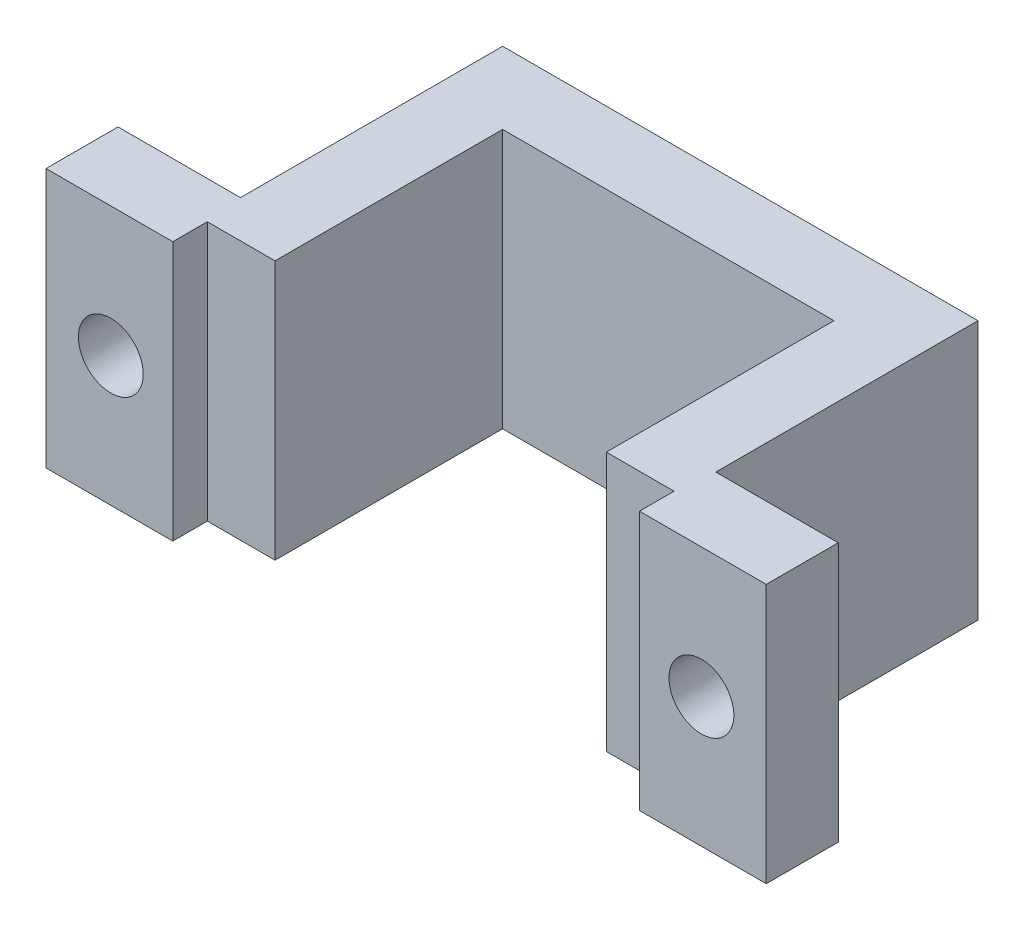
ISO-10303-21;
HEADER;
FILE_DESCRIPTION(('STEP AP214'),'2;1');
FILE_NAME('part.step','',(''),(''),'','','');
FILE_SCHEMA(('AUTOMOTIVE_DESIGN { 1 0 10303 214 1 1 1 1 }'));
ENDSEC;
DATA;
#1=APPLICATION_CONTEXT('core data for automotive mechanical design processes');
#2=APPLICATION_PROTOCOL_DEFINITION('international standard','automotive_design',2000,#1);
#3=PRODUCT_CONTEXT('',#1,'mechanical');
#4=PRODUCT('Part','Part','',(#3));
#5=PRODUCT_RELATED_PRODUCT_CATEGORY('part','',(#4));
#6=PRODUCT_DEFINITION_FORMATION('','',#4);
#7=PRODUCT_DEFINITION_CONTEXT('part definition',#1,'design');
#8=PRODUCT_DEFINITION('design','',#6,#7);
#9=PRODUCT_DEFINITION_SHAPE('','',#8);
#10=(LENGTH_UNIT() NAMED_UNIT(*) SI_UNIT(.MILLI.,.METRE.));
#11=(NAMED_UNIT(*) PLANE_ANGLE_UNIT() SI_UNIT($,.RADIAN.));
#12=(NAMED_UNIT(*) SI_UNIT($,.STERADIAN.) SOLID_ANGLE_UNIT());
#13=UNCERTAINTY_MEASURE_WITH_UNIT(LENGTH_MEASURE(1.E-05),#10,'distance_accuracy_value','');
#14=(GEOMETRIC_REPRESENTATION_CONTEXT(3) GLOBAL_UNCERTAINTY_ASSIGNED_CONTEXT((#13)) GLOBAL_UNIT_ASSIGNED_CONTEXT((#10,
#11,#12)) REPRESENTATION_CONTEXT('',''));
#15=CARTESIAN_POINT('',(0.,0.,0.));
#16=DIRECTION('',(0.,0.,1.));
#17=DIRECTION('',(1.,0.,0.));
#18=AXIS2_PLACEMENT_3D('',#15,#16,#17);
#19=CARTESIAN_POINT('',(0.,18.,0.));
#20=DIRECTION('',(1.,0.,0.));
#21=DIRECTION('',(0.,0.,-1.));
#22=AXIS2_PLACEMENT_3D('',#19,#20,#21);
#23=PLANE('',#22);
#24=DIRECTION('',(0.,0.,1.));
#25=VECTOR('',#24,1.);
#26=CARTESIAN_POINT('',(0.,0.,0.));
#27=LINE('',#26,#25);
#28=CARTESIAN_POINT('',(0.,0.,-5.));
#29=VERTEX_POINT('',#28);
#30=CARTESIAN_POINT('',(0.,0.,0.));
#31=VERTEX_POINT('',#30);
#32=EDGE_CURVE('E181',#29,#31,#27,.T.);
#33=ORIENTED_EDGE('',*,*,#32,.T.);
#34=DIRECTION('',(0.,-1.,0.));
#35=VECTOR('',#34,1.);
#36=CARTESIAN_POINT('',(0.,18.,0.));
#37=LINE('',#36,#35);
#38=CARTESIAN_POINT('',(0.,18.,0.));
#39=VERTEX_POINT('',#38);
#40=EDGE_CURVE('E11',#39,#31,#37,.T.);
#41=ORIENTED_EDGE('',*,*,#40,.F.);
#42=DIRECTION('',(0.,0.,1.));
#43=VECTOR('',#42,1.);
#44=CARTESIAN_POINT('',(0.,18.,0.));
#45=LINE('',#44,#43);
#46=CARTESIAN_POINT('',(0.,18.,-5.));
#47=VERTEX_POINT('',#46);
#48=EDGE_CURVE('E212',#47,#39,#45,.T.);
#49=ORIENTED_EDGE('',*,*,#48,.F.);
#50=DIRECTION('',(0.,-1.,0.));
#51=VECTOR('',#50,1.);
#52=CARTESIAN_POINT('',(0.,18.,-5.));
#53=LINE('',#52,#51);
#54=EDGE_CURVE('E177',#47,#29,#53,.T.);
#55=ORIENTED_EDGE('',*,*,#54,.T.);
#56=EDGE_LOOP('',(#33,#41,#49,#55));
#57=FACE_BOUND('',#56,.T.);
#58=ADVANCED_FACE('F37',(#57),#23,.F.);
#59=CARTESIAN_POINT('',(0.,18.,0.));
#60=DIRECTION('',(0.,0.,-1.));
#61=DIRECTION('',(-1.,0.,0.));
#62=AXIS2_PLACEMENT_3D('',#59,#60,#61);
#63=PLANE('',#62);
#64=CARTESIAN_POINT('',(4.49999999999999,9.,0.));
#65=DIRECTION('',(0.,0.,-1.));
#66=DIRECTION('',(1.,0.,0.));
#67=AXIS2_PLACEMENT_3D('',#64,#65,#66);
#68=CIRCLE('',#67,2.25);
#69=CARTESIAN_POINT('',(6.74999999999999,9.,0.));
#70=VERTEX_POINT('',#69);
#71=EDGE_CURVE('E433',#70,#70,#68,.T.);
#72=ORIENTED_EDGE('',*,*,#71,.T.);
#73=EDGE_LOOP('',(#72));
#74=FACE_BOUND('',#73,.T.);
#75=DIRECTION('',(1.,0.,0.));
#76=VECTOR('',#75,1.);
#77=CARTESIAN_POINT('',(0.,0.,0.));
#78=LINE('',#77,#76);
#79=CARTESIAN_POINT('',(8.8,0.,0.));
#80=VERTEX_POINT('',#79);
#81=EDGE_CURVE('E184',#31,#80,#78,.T.);
#82=ORIENTED_EDGE('',*,*,#81,.T.);
#83=DIRECTION('',(0.,-1.,0.));
#84=VECTOR('',#83,1.);
#85=CARTESIAN_POINT('',(8.8,18.,0.));
#86=LINE('',#85,#84);
#87=CARTESIAN_POINT('',(8.8,18.,0.));
#88=VERTEX_POINT('',#87);
#89=EDGE_CURVE('E45',#88,#80,#86,.T.);
#90=ORIENTED_EDGE('',*,*,#89,.F.);
#91=DIRECTION('',(1.,0.,0.));
#92=VECTOR('',#91,1.);
#93=CARTESIAN_POINT('',(0.,18.,0.));
#94=LINE('',#93,#92);
#95=EDGE_CURVE('E120',#39,#88,#94,.T.);
#96=ORIENTED_EDGE('',*,*,#95,.F.);
#97=ORIENTED_EDGE('',*,*,#40,.T.);
#98=EDGE_LOOP('',(#82,#90,#96,#97));
#99=FACE_BOUND('',#98,.T.);
#100=ADVANCED_FACE('F312',(#74,#99),#63,.F.);
#101=CARTESIAN_POINT('',(8.8,18.,0.));
#102=DIRECTION('',(-1.,0.,0.));
#103=DIRECTION('',(0.,0.,1.));
#104=AXIS2_PLACEMENT_3D('',#101,#102,#103);
#105=PLANE('',#104);
#106=DIRECTION('',(0.,0.,-1.));
#107=VECTOR('',#106,1.);
#108=CARTESIAN_POINT('',(8.8,0.,0.));
#109=LINE('',#108,#107);
#110=CARTESIAN_POINT('',(8.8,0.,-2.4));
#111=VERTEX_POINT('',#110);
#112=EDGE_CURVE('E187',#80,#111,#109,.T.);
#113=ORIENTED_EDGE('',*,*,#112,.T.);
#114=DIRECTION('',(0.,-1.,0.));
#115=VECTOR('',#114,1.);
#116=CARTESIAN_POINT('',(8.8,18.,-2.4));
#117=LINE('',#116,#115);
#118=CARTESIAN_POINT('',(8.8,18.,-2.4));
#119=VERTEX_POINT('',#118);
#120=EDGE_CURVE('E243',#119,#111,#117,.T.);
#121=ORIENTED_EDGE('',*,*,#120,.F.);
#122=DIRECTION('',(0.,0.,-1.));
#123=VECTOR('',#122,1.);
#124=CARTESIAN_POINT('',(8.8,18.,0.));
#125=LINE('',#124,#123);
#126=EDGE_CURVE('E251',#88,#119,#125,.T.);
#127=ORIENTED_EDGE('',*,*,#126,.F.);
#128=ORIENTED_EDGE('',*,*,#89,.T.);
#129=EDGE_LOOP('',(#113,#121,#127,#128));
#130=FACE_BOUND('',#129,.T.);
#131=ADVANCED_FACE('F249',(#130),#105,.F.);
#132=CARTESIAN_POINT('',(8.8,18.,-2.4));
#133=DIRECTION('',(0.,0.,-1.));
#134=DIRECTION('',(-1.,0.,0.));
#135=AXIS2_PLACEMENT_3D('',#132,#133,#134);
#136=PLANE('',#135);
#137=DIRECTION('',(1.,0.,0.));
#138=VECTOR('',#137,1.);
#139=CARTESIAN_POINT('',(8.8,0.,-2.4));
#140=LINE('',#139,#138);
#141=CARTESIAN_POINT('',(13.5,0.,-2.4));
#142=VERTEX_POINT('',#141);
#143=EDGE_CURVE('E189',#111,#142,#140,.T.);
#144=ORIENTED_EDGE('',*,*,#143,.T.);
#145=DIRECTION('',(0.,-1.,0.));
#146=VECTOR('',#145,1.);
#147=CARTESIAN_POINT('',(13.5,18.,-2.4));
#148=LINE('',#147,#146);
#149=CARTESIAN_POINT('',(13.5,18.,-2.4));
#150=VERTEX_POINT('',#149);
#151=EDGE_CURVE('E240',#150,#142,#148,.T.);
#152=ORIENTED_EDGE('',*,*,#151,.F.);
#153=DIRECTION('',(1.,0.,0.));
#154=VECTOR('',#153,1.);
#155=CARTESIAN_POINT('',(8.8,18.,-2.4));
#156=LINE('',#155,#154);
#157=EDGE_CURVE('E269',#119,#150,#156,.T.);
#158=ORIENTED_EDGE('',*,*,#157,.F.);
#159=ORIENTED_EDGE('',*,*,#120,.T.);
#160=EDGE_LOOP('',(#144,#152,#158,#159));
#161=FACE_BOUND('',#160,.T.);
#162=ADVANCED_FACE('F260',(#161),#136,.F.);
#163=CARTESIAN_POINT('',(13.5,18.,-2.4));
#164=DIRECTION('',(-1.,0.,0.));
#165=DIRECTION('',(0.,0.,1.));
#166=AXIS2_PLACEMENT_3D('',#163,#164,#165);
#167=PLANE('',#166);
#168=DIRECTION('',(0.,0.,-1.));
#169=VECTOR('',#168,1.);
#170=CARTESIAN_POINT('',(13.5,0.,-2.4));
#171=LINE('',#170,#169);
#172=CARTESIAN_POINT('',(13.5,0.,-18.2));
#173=VERTEX_POINT('',#172);
#174=EDGE_CURVE('E191',#142,#173,#171,.T.);
#175=ORIENTED_EDGE('',*,*,#174,.T.);
#176=DIRECTION('',(0.,-1.,0.));
#177=VECTOR('',#176,1.);
#178=CARTESIAN_POINT('',(13.5,18.,-18.2));
#179=LINE('',#178,#177);
#180=CARTESIAN_POINT('',(13.5,18.,-18.2));
#181=VERTEX_POINT('',#180);
#182=EDGE_CURVE('E237',#181,#173,#179,.T.);
#183=ORIENTED_EDGE('',*,*,#182,.F.);
#184=DIRECTION('',(0.,0.,-1.));
#185=VECTOR('',#184,1.);
#186=CARTESIAN_POINT('',(13.5,18.,-2.4));
#187=LINE('',#186,#185);
#188=EDGE_CURVE('E266',#150,#181,#187,.T.);
#189=ORIENTED_EDGE('',*,*,#188,.F.);
#190=ORIENTED_EDGE('',*,*,#151,.T.);
#191=EDGE_LOOP('',(#175,#183,#189,#190));
#192=FACE_BOUND('',#191,.T.);
#193=ADVANCED_FACE('F264',(#192),#167,.F.);
#194=CARTESIAN_POINT('',(13.5,18.,-18.2));
#195=DIRECTION('',(0.,0.,-1.));
#196=DIRECTION('',(-1.,0.,0.));
#197=AXIS2_PLACEMENT_3D('',#194,#195,#196);
#198=PLANE('',#197);
#199=DIRECTION('',(1.,0.,0.));
#200=VECTOR('',#199,1.);
#201=CARTESIAN_POINT('',(13.5,0.,-18.2));
#202=LINE('',#201,#200);
#203=CARTESIAN_POINT('',(36.5,0.,-18.2));
#204=VERTEX_POINT('',#203);
#205=EDGE_CURVE('E193',#173,#204,#202,.T.);
#206=ORIENTED_EDGE('',*,*,#205,.T.);
#207=DIRECTION('',(0.,-1.,0.));
#208=VECTOR('',#207,1.);
#209=CARTESIAN_POINT('',(36.5,18.,-18.2));
#210=LINE('',#209,#208);
#211=CARTESIAN_POINT('',(36.5,18.,-18.2));
#212=VERTEX_POINT('',#211);
#213=EDGE_CURVE('E234',#212,#204,#210,.T.);
#214=ORIENTED_EDGE('',*,*,#213,.F.);
#215=DIRECTION('',(1.,0.,0.));
#216=VECTOR('',#215,1.);
#217=CARTESIAN_POINT('',(13.5,18.,-18.2));
#218=LINE('',#217,#216);
#219=EDGE_CURVE('E268',#181,#212,#218,.T.);
#220=ORIENTED_EDGE('',*,*,#219,.F.);
#221=ORIENTED_EDGE('',*,*,#182,.T.);
#222=EDGE_LOOP('',(#206,#214,#220,#221));
#223=FACE_BOUND('',#222,.T.);
#224=ADVANCED_FACE('F327',(#223),#198,.F.);
#225=CARTESIAN_POINT('',(36.5,18.,-2.40000000000001));
#226=DIRECTION('',(1.,0.,0.));
#227=DIRECTION('',(0.,0.,-1.));
#228=AXIS2_PLACEMENT_3D('',#225,#226,#227);
#229=PLANE('',#228);
#230=DIRECTION('',(0.,0.,1.));
#231=VECTOR('',#230,1.);
#232=CARTESIAN_POINT('',(36.5,0.,-2.40000000000001));
#233=LINE('',#232,#231);
#234=CARTESIAN_POINT('',(36.5,0.,-2.40000000000001));
#235=VERTEX_POINT('',#234);
#236=EDGE_CURVE('E195',#204,#235,#233,.T.);
#237=ORIENTED_EDGE('',*,*,#236,.T.);
#238=DIRECTION('',(0.,-1.,0.));
#239=VECTOR('',#238,1.);
#240=CARTESIAN_POINT('',(36.5,18.,-2.40000000000001));
#241=LINE('',#240,#239);
#242=CARTESIAN_POINT('',(36.5,18.,-2.40000000000001));
#243=VERTEX_POINT('',#242);
#244=EDGE_CURVE('E231',#243,#235,#241,.T.);
#245=ORIENTED_EDGE('',*,*,#244,.F.);
#246=DIRECTION('',(0.,0.,1.));
#247=VECTOR('',#246,1.);
#248=CARTESIAN_POINT('',(36.5,18.,-2.40000000000001));
#249=LINE('',#248,#247);
#250=EDGE_CURVE('E271',#212,#243,#249,.T.);
#251=ORIENTED_EDGE('',*,*,#250,.F.);
#252=ORIENTED_EDGE('',*,*,#213,.T.);
#253=EDGE_LOOP('',(#237,#245,#251,#252));
#254=FACE_BOUND('',#253,.T.);
#255=ADVANCED_FACE('F330',(#254),#229,.F.);
#256=CARTESIAN_POINT('',(41.2,18.,-2.40000000000002));
#257=DIRECTION('',(0.,0.,-1.));
#258=DIRECTION('',(-1.,0.,0.));
#259=AXIS2_PLACEMENT_3D('',#256,#257,#258);
#260=PLANE('',#259);
#261=DIRECTION('',(1.,0.,0.));
#262=VECTOR('',#261,1.);
#263=CARTESIAN_POINT('',(41.2,0.,-2.40000000000002));
#264=LINE('',#263,#262);
#265=CARTESIAN_POINT('',(41.2,0.,-2.40000000000002));
#266=VERTEX_POINT('',#265);
#267=EDGE_CURVE('E197',#235,#266,#264,.T.);
#268=ORIENTED_EDGE('',*,*,#267,.T.);
#269=DIRECTION('',(0.,-1.,0.));
#270=VECTOR('',#269,1.);
#271=CARTESIAN_POINT('',(41.2,18.,-2.40000000000002));
#272=LINE('',#271,#270);
#273=CARTESIAN_POINT('',(41.2,18.,-2.40000000000002));
#274=VERTEX_POINT('',#273);
#275=EDGE_CURVE('E228',#274,#266,#272,.T.);
#276=ORIENTED_EDGE('',*,*,#275,.F.);
#277=DIRECTION('',(1.,0.,0.));
#278=VECTOR('',#277,1.);
#279=CARTESIAN_POINT('',(41.2,18.,-2.40000000000002));
#280=LINE('',#279,#278);
#281=EDGE_CURVE('E277',#243,#274,#280,.T.);
#282=ORIENTED_EDGE('',*,*,#281,.F.);
#283=ORIENTED_EDGE('',*,*,#244,.T.);
#284=EDGE_LOOP('',(#268,#276,#282,#283));
#285=FACE_BOUND('',#284,.T.);
#286=ADVANCED_FACE('F334',(#285),#260,.F.);
#287=CARTESIAN_POINT('',(41.2,18.,0.));
#288=DIRECTION('',(1.,0.,0.));
#289=DIRECTION('',(0.,0.,-1.));
#290=AXIS2_PLACEMENT_3D('',#287,#288,#289);
#291=PLANE('',#290);
#292=DIRECTION('',(0.,0.,1.));
#293=VECTOR('',#292,1.);
#294=CARTESIAN_POINT('',(41.2,0.,0.));
#295=LINE('',#294,#293);
#296=CARTESIAN_POINT('',(41.2,0.,0.));
#297=VERTEX_POINT('',#296);
#298=EDGE_CURVE('E199',#266,#297,#295,.T.);
#299=ORIENTED_EDGE('',*,*,#298,.T.);
#300=DIRECTION('',(0.,-1.,0.));
#301=VECTOR('',#300,1.);
#302=CARTESIAN_POINT('',(41.2,18.,0.));
#303=LINE('',#302,#301);
#304=CARTESIAN_POINT('',(41.2,18.,0.));
#305=VERTEX_POINT('',#304);
#306=EDGE_CURVE('E225',#305,#297,#303,.T.);
#307=ORIENTED_EDGE('',*,*,#306,.F.);
#308=DIRECTION('',(0.,0.,1.));
#309=VECTOR('',#308,1.);
#310=CARTESIAN_POINT('',(41.2,18.,0.));
#311=LINE('',#310,#309);
#312=EDGE_CURVE('E279',#274,#305,#311,.T.);
#313=ORIENTED_EDGE('',*,*,#312,.F.);
#314=ORIENTED_EDGE('',*,*,#275,.T.);
#315=EDGE_LOOP('',(#299,#307,#313,#314));
#316=FACE_BOUND('',#315,.T.);
#317=ADVANCED_FACE('F338',(#316),#291,.F.);
#318=CARTESIAN_POINT('',(50.,18.,0.));
#319=DIRECTION('',(0.,0.,-1.));
#320=DIRECTION('',(-1.,0.,0.));
#321=AXIS2_PLACEMENT_3D('',#318,#319,#320);
#322=PLANE('',#321);
#323=CARTESIAN_POINT('',(45.5,9.,0.));
#324=DIRECTION('',(0.,0.,-1.));
#325=DIRECTION('',(-1.,0.,0.));
#326=AXIS2_PLACEMENT_3D('',#323,#324,#325);
#327=CIRCLE('',#326,2.25);
#328=CARTESIAN_POINT('',(43.25,9.,0.));
#329=VERTEX_POINT('',#328);
#330=EDGE_CURVE('E185',#329,#329,#327,.T.);
#331=ORIENTED_EDGE('',*,*,#330,.T.);
#332=EDGE_LOOP('',(#331));
#333=FACE_BOUND('',#332,.T.);
#334=DIRECTION('',(1.,0.,0.));
#335=VECTOR('',#334,1.);
#336=CARTESIAN_POINT('',(50.,0.,0.));
#337=LINE('',#336,#335);
#338=CARTESIAN_POINT('',(50.,0.,0.));
#339=VERTEX_POINT('',#338);
#340=EDGE_CURVE('E201',#297,#339,#337,.T.);
#341=ORIENTED_EDGE('',*,*,#340,.T.);
#342=DIRECTION('',(0.,-1.,0.));
#343=VECTOR('',#342,1.);
#344=CARTESIAN_POINT('',(50.,18.,0.));
#345=LINE('',#344,#343);
#346=CARTESIAN_POINT('',(50.,18.,0.));
#347=VERTEX_POINT('',#346);
#348=EDGE_CURVE('E222',#347,#339,#345,.T.);
#349=ORIENTED_EDGE('',*,*,#348,.F.);
#350=DIRECTION('',(1.,0.,0.));
#351=VECTOR('',#350,1.);
#352=CARTESIAN_POINT('',(50.,18.,0.));
#353=LINE('',#352,#351);
#354=EDGE_CURVE('E281',#305,#347,#353,.T.);
#355=ORIENTED_EDGE('',*,*,#354,.F.);
#356=ORIENTED_EDGE('',*,*,#306,.T.);
#357=EDGE_LOOP('',(#341,#349,#355,#356));
#358=FACE_BOUND('',#357,.T.);
#359=ADVANCED_FACE('F342',(#333,#358),#322,.F.);
#360=CARTESIAN_POINT('',(50.,18.,0.));
#361=DIRECTION('',(-1.,0.,0.));
#362=DIRECTION('',(0.,0.,1.));
#363=AXIS2_PLACEMENT_3D('',#360,#361,#362);
#364=PLANE('',#363);
#365=DIRECTION('',(0.,0.,-1.));
#366=VECTOR('',#365,1.);
#367=CARTESIAN_POINT('',(50.,0.,0.));
#368=LINE('',#367,#366);
#369=CARTESIAN_POINT('',(50.,0.,-5.00000000000002));
#370=VERTEX_POINT('',#369);
#371=EDGE_CURVE('E203',#339,#370,#368,.T.);
#372=ORIENTED_EDGE('',*,*,#371,.T.);
#373=DIRECTION('',(0.,-1.,0.));
#374=VECTOR('',#373,1.);
#375=CARTESIAN_POINT('',(50.,18.,-5.00000000000002));
#376=LINE('',#375,#374);
#377=CARTESIAN_POINT('',(50.,18.,-5.00000000000002));
#378=VERTEX_POINT('',#377);
#379=EDGE_CURVE('E219',#378,#370,#376,.T.);
#380=ORIENTED_EDGE('',*,*,#379,.F.);
#381=DIRECTION('',(0.,0.,-1.));
#382=VECTOR('',#381,1.);
#383=CARTESIAN_POINT('',(50.,18.,0.));
#384=LINE('',#383,#382);
#385=EDGE_CURVE('E283',#347,#378,#384,.T.);
#386=ORIENTED_EDGE('',*,*,#385,.F.);
#387=ORIENTED_EDGE('',*,*,#348,.T.);
#388=EDGE_LOOP('',(#372,#380,#386,#387));
#389=FACE_BOUND('',#388,.T.);
#390=ADVANCED_FACE('F346',(#389),#364,.F.);
#391=CARTESIAN_POINT('',(50.,18.,-5.00000000000002));
#392=DIRECTION('',(0.,0.,1.));
#393=DIRECTION('',(1.,0.,0.));
#394=AXIS2_PLACEMENT_3D('',#391,#392,#393);
#395=PLANE('',#394);
#396=CARTESIAN_POINT('',(45.5,9.,-5.00000000000002));
#397=DIRECTION('',(0.,0.,-1.));
#398=DIRECTION('',(-1.,0.,0.));
#399=AXIS2_PLACEMENT_3D('',#396,#397,#398);
#400=CIRCLE('',#399,2.25);
#401=CARTESIAN_POINT('',(43.25,9.,-5.00000000000002));
#402=VERTEX_POINT('',#401);
#403=EDGE_CURVE('E432',#402,#402,#400,.T.);
#404=ORIENTED_EDGE('',*,*,#403,.F.);
#405=EDGE_LOOP('',(#404));
#406=FACE_BOUND('',#405,.T.);
#407=DIRECTION('',(-1.,0.,0.));
#408=VECTOR('',#407,1.);
#409=CARTESIAN_POINT('',(50.,0.,-5.00000000000002));
#410=LINE('',#409,#408);
#411=CARTESIAN_POINT('',(41.5,0.,-5.00000000000002));
#412=VERTEX_POINT('',#411);
#413=EDGE_CURVE('E205',#370,#412,#410,.T.);
#414=ORIENTED_EDGE('',*,*,#413,.T.);
#415=DIRECTION('',(0.,-1.,0.));
#416=VECTOR('',#415,1.);
#417=CARTESIAN_POINT('',(41.5,18.,-5.00000000000002));
#418=LINE('',#417,#416);
#419=CARTESIAN_POINT('',(41.5,18.,-5.00000000000002));
#420=VERTEX_POINT('',#419);
#421=EDGE_CURVE('E216',#420,#412,#418,.T.);
#422=ORIENTED_EDGE('',*,*,#421,.F.);
#423=DIRECTION('',(-1.,0.,0.));
#424=VECTOR('',#423,1.);
#425=CARTESIAN_POINT('',(50.,18.,-5.00000000000002));
#426=LINE('',#425,#424);
#427=EDGE_CURVE('E285',#378,#420,#426,.T.);
#428=ORIENTED_EDGE('',*,*,#427,.F.);
#429=ORIENTED_EDGE('',*,*,#379,.T.);
#430=EDGE_LOOP('',(#414,#422,#428,#429));
#431=FACE_BOUND('',#430,.T.);
#432=ADVANCED_FACE('F291',(#406,#431),#395,.F.);
#433=CARTESIAN_POINT('',(41.5,18.,-5.00000000000002));
#434=DIRECTION('',(-1.,0.,0.));
#435=DIRECTION('',(0.,0.,1.));
#436=AXIS2_PLACEMENT_3D('',#433,#434,#435);
#437=PLANE('',#436);
#438=DIRECTION('',(0.,0.,-1.));
#439=VECTOR('',#438,1.);
#440=CARTESIAN_POINT('',(41.5,0.,-5.00000000000002));
#441=LINE('',#440,#439);
#442=CARTESIAN_POINT('',(41.5,0.,-23.2));
#443=VERTEX_POINT('',#442);
#444=EDGE_CURVE('E207',#412,#443,#441,.T.);
#445=ORIENTED_EDGE('',*,*,#444,.T.);
#446=DIRECTION('',(0.,-1.,0.));
#447=VECTOR('',#446,1.);
#448=CARTESIAN_POINT('',(41.5,18.,-23.2));
#449=LINE('',#448,#447);
#450=CARTESIAN_POINT('',(41.5,18.,-23.2));
#451=VERTEX_POINT('',#450);
#452=EDGE_CURVE('E172',#451,#443,#449,.T.);
#453=ORIENTED_EDGE('',*,*,#452,.F.);
#454=DIRECTION('',(0.,0.,-1.));
#455=VECTOR('',#454,1.);
#456=CARTESIAN_POINT('',(41.5,18.,-5.00000000000002));
#457=LINE('',#456,#455);
#458=EDGE_CURVE('E163',#420,#451,#457,.T.);
#459=ORIENTED_EDGE('',*,*,#458,.F.);
#460=ORIENTED_EDGE('',*,*,#421,.T.);
#461=EDGE_LOOP('',(#445,#453,#459,#460));
#462=FACE_BOUND('',#461,.T.);
#463=ADVANCED_FACE('F295',(#462),#437,.F.);
#464=CARTESIAN_POINT('',(8.5,18.,-23.2));
#465=DIRECTION('',(0.,0.,1.));
#466=DIRECTION('',(1.,0.,0.));
#467=AXIS2_PLACEMENT_3D('',#464,#465,#466);
#468=PLANE('',#467);
#469=DIRECTION('',(-1.,0.,0.));
#470=VECTOR('',#469,1.);
#471=CARTESIAN_POINT('',(8.5,0.,-23.2));
#472=LINE('',#471,#470);
#473=CARTESIAN_POINT('',(8.5,0.,-23.2));
#474=VERTEX_POINT('',#473);
#475=EDGE_CURVE('E171',#443,#474,#472,.T.);
#476=ORIENTED_EDGE('',*,*,#475,.T.);
#477=DIRECTION('',(0.,-1.,0.));
#478=VECTOR('',#477,1.);
#479=CARTESIAN_POINT('',(8.5,18.,-23.2));
#480=LINE('',#479,#478);
#481=CARTESIAN_POINT('',(8.5,18.,-23.2));
#482=VERTEX_POINT('',#481);
#483=EDGE_CURVE('E168',#482,#474,#480,.T.);
#484=ORIENTED_EDGE('',*,*,#483,.F.);
#485=DIRECTION('',(-1.,0.,0.));
#486=VECTOR('',#485,1.);
#487=CARTESIAN_POINT('',(8.5,18.,-23.2));
#488=LINE('',#487,#486);
#489=EDGE_CURVE('E157',#451,#482,#488,.T.);
#490=ORIENTED_EDGE('',*,*,#489,.F.);
#491=ORIENTED_EDGE('',*,*,#452,.T.);
#492=EDGE_LOOP('',(#476,#484,#490,#491));
#493=FACE_BOUND('',#492,.T.);
#494=ADVANCED_FACE('F169',(#493),#468,.F.);
#495=CARTESIAN_POINT('',(8.5,18.,-5.));
#496=DIRECTION('',(1.,0.,0.));
#497=DIRECTION('',(0.,0.,-1.));
#498=AXIS2_PLACEMENT_3D('',#495,#496,#497);
#499=PLANE('',#498);
#500=DIRECTION('',(0.,0.,1.));
#501=VECTOR('',#500,1.);
#502=CARTESIAN_POINT('',(8.5,0.,-5.));
#503=LINE('',#502,#501);
#504=CARTESIAN_POINT('',(8.5,0.,-5.));
#505=VERTEX_POINT('',#504);
#506=EDGE_CURVE('E106',#474,#505,#503,.T.);
#507=ORIENTED_EDGE('',*,*,#506,.T.);
#508=DIRECTION('',(0.,-1.,0.));
#509=VECTOR('',#508,1.);
#510=CARTESIAN_POINT('',(8.5,18.,-5.));
#511=LINE('',#510,#509);
#512=CARTESIAN_POINT('',(8.5,18.,-5.));
#513=VERTEX_POINT('',#512);
#514=EDGE_CURVE('E173',#513,#505,#511,.T.);
#515=ORIENTED_EDGE('',*,*,#514,.F.);
#516=DIRECTION('',(0.,0.,1.));
#517=VECTOR('',#516,1.);
#518=CARTESIAN_POINT('',(8.5,18.,-5.));
#519=LINE('',#518,#517);
#520=EDGE_CURVE('E161',#482,#513,#519,.T.);
#521=ORIENTED_EDGE('',*,*,#520,.F.);
#522=ORIENTED_EDGE('',*,*,#483,.T.);
#523=EDGE_LOOP('',(#507,#515,#521,#522));
#524=FACE_BOUND('',#523,.T.);
#525=ADVANCED_FACE('F175',(#524),#499,.F.);
#526=CARTESIAN_POINT('',(0.,18.,-5.));
#527=DIRECTION('',(0.,0.,1.));
#528=DIRECTION('',(1.,0.,0.));
#529=AXIS2_PLACEMENT_3D('',#526,#527,#528);
#530=PLANE('',#529);
#531=CARTESIAN_POINT('',(4.49999999999999,9.,-5.00000000000002));
#532=DIRECTION('',(0.,0.,-1.));
#533=DIRECTION('',(1.,0.,0.));
#534=AXIS2_PLACEMENT_3D('',#531,#532,#533);
#535=CIRCLE('',#534,2.25);
#536=CARTESIAN_POINT('',(6.74999999999999,9.,-5.00000000000002));
#537=VERTEX_POINT('',#536);
#538=EDGE_CURVE('E436',#537,#537,#535,.T.);
#539=ORIENTED_EDGE('',*,*,#538,.F.);
#540=EDGE_LOOP('',(#539));
#541=FACE_BOUND('',#540,.T.);
#542=DIRECTION('',(-1.,0.,0.));
#543=VECTOR('',#542,1.);
#544=CARTESIAN_POINT('',(0.,0.,-5.));
#545=LINE('',#544,#543);
#546=EDGE_CURVE('E112',#505,#29,#545,.T.);
#547=ORIENTED_EDGE('',*,*,#546,.T.);
#548=ORIENTED_EDGE('',*,*,#54,.F.);
#549=DIRECTION('',(-1.,0.,0.));
#550=VECTOR('',#549,1.);
#551=CARTESIAN_POINT('',(0.,18.,-5.));
#552=LINE('',#551,#550);
#553=EDGE_CURVE('E53',#513,#47,#552,.T.);
#554=ORIENTED_EDGE('',*,*,#553,.F.);
#555=ORIENTED_EDGE('',*,*,#514,.T.);
#556=EDGE_LOOP('',(#547,#548,#554,#555));
#557=FACE_BOUND('',#556,.T.);
#558=ADVANCED_FACE('F299',(#541,#557),#530,.F.);
#559=CARTESIAN_POINT('',(0.,18.,0.));
#560=DIRECTION('',(0.,-1.,0.));
#561=DIRECTION('',(0.,0.,-1.));
#562=AXIS2_PLACEMENT_3D('',#559,#560,#561);
#563=PLANE('',#562);
#564=ORIENTED_EDGE('',*,*,#48,.T.);
#565=ORIENTED_EDGE('',*,*,#95,.T.);
#566=ORIENTED_EDGE('',*,*,#126,.T.);
#567=ORIENTED_EDGE('',*,*,#157,.T.);
#568=ORIENTED_EDGE('',*,*,#188,.T.);
#569=ORIENTED_EDGE('',*,*,#219,.T.);
#570=ORIENTED_EDGE('',*,*,#250,.T.);
#571=ORIENTED_EDGE('',*,*,#281,.T.);
#572=ORIENTED_EDGE('',*,*,#312,.T.);
#573=ORIENTED_EDGE('',*,*,#354,.T.);
#574=ORIENTED_EDGE('',*,*,#385,.T.);
#575=ORIENTED_EDGE('',*,*,#427,.T.);
#576=ORIENTED_EDGE('',*,*,#458,.T.);
#577=ORIENTED_EDGE('',*,*,#489,.T.);
#578=ORIENTED_EDGE('',*,*,#520,.T.);
#579=ORIENTED_EDGE('',*,*,#553,.T.);
#580=EDGE_LOOP('',(#564,#565,#566,#567,#568,#569,#570,#571,#572,#573,#574,#575,#576,#577,#578,#579));
#581=FACE_BOUND('',#580,.T.);
#582=ADVANCED_FACE('F159',(#581),#563,.F.);
#583=CARTESIAN_POINT('',(0.,0.,0.));
#584=DIRECTION('',(0.,-1.,0.));
#585=DIRECTION('',(0.,0.,-1.));
#586=AXIS2_PLACEMENT_3D('',#583,#584,#585);
#587=PLANE('',#586);
#588=ORIENTED_EDGE('',*,*,#32,.F.);
#589=ORIENTED_EDGE('',*,*,#546,.F.);
#590=ORIENTED_EDGE('',*,*,#506,.F.);
#591=ORIENTED_EDGE('',*,*,#475,.F.);
#592=ORIENTED_EDGE('',*,*,#444,.F.);
#593=ORIENTED_EDGE('',*,*,#413,.F.);
#594=ORIENTED_EDGE('',*,*,#371,.F.);
#595=ORIENTED_EDGE('',*,*,#340,.F.);
#596=ORIENTED_EDGE('',*,*,#298,.F.);
#597=ORIENTED_EDGE('',*,*,#267,.F.);
#598=ORIENTED_EDGE('',*,*,#236,.F.);
#599=ORIENTED_EDGE('',*,*,#205,.F.);
#600=ORIENTED_EDGE('',*,*,#174,.F.);
#601=ORIENTED_EDGE('',*,*,#143,.F.);
#602=ORIENTED_EDGE('',*,*,#112,.F.);
#603=ORIENTED_EDGE('',*,*,#81,.F.);
#604=EDGE_LOOP('',(#588,#589,#590,#591,#592,#593,#594,#595,#596,#597,#598,#599,#600,#601,#602,#603));
#605=FACE_BOUND('',#604,.T.);
#606=ADVANCED_FACE('F255',(#605),#587,.T.);
#607=CARTESIAN_POINT('',(4.49999999999999,9.,0.));
#608=DIRECTION('',(0.,0.,-1.));
#609=DIRECTION('',(-1.,0.,0.));
#610=AXIS2_PLACEMENT_3D('',#607,#608,#609);
#611=CYLINDRICAL_SURFACE('',#610,2.25);
#612=ORIENTED_EDGE('',*,*,#71,.F.);
#613=EDGE_LOOP('',(#612));
#614=FACE_BOUND('',#613,.T.);
#615=ORIENTED_EDGE('',*,*,#538,.T.);
#616=EDGE_LOOP('',(#615));
#617=FACE_BOUND('',#616,.T.);
#618=ADVANCED_FACE('F380',(#614,#617),#611,.F.);
#619=CARTESIAN_POINT('',(45.5,9.,0.));
#620=DIRECTION('',(0.,0.,-1.));
#621=DIRECTION('',(-1.,0.,0.));
#622=AXIS2_PLACEMENT_3D('',#619,#620,#621);
#623=CYLINDRICAL_SURFACE('',#622,2.25);
#624=ORIENTED_EDGE('',*,*,#330,.F.);
#625=EDGE_LOOP('',(#624));
#626=FACE_BOUND('',#625,.T.);
#627=ORIENTED_EDGE('',*,*,#403,.T.);
#628=EDGE_LOOP('',(#627));
#629=FACE_BOUND('',#628,.T.);
#630=ADVANCED_FACE('F413',(#626,#629),#623,.F.);
#631=CLOSED_SHELL('',(#58,#100,#131,#162,#193,#224,#255,#286,#317,#359,#390,#432,#463,#494,#525,
#558,#582,#606,#618,#630));
#632=MANIFOLD_SOLID_BREP('B2',#631);
#633=ADVANCED_BREP_SHAPE_REPRESENTATION('',(#18,#632),#14);
#634=SHAPE_DEFINITION_REPRESENTATION(#9,#633);
ENDSEC;
END-ISO-10303-21;
